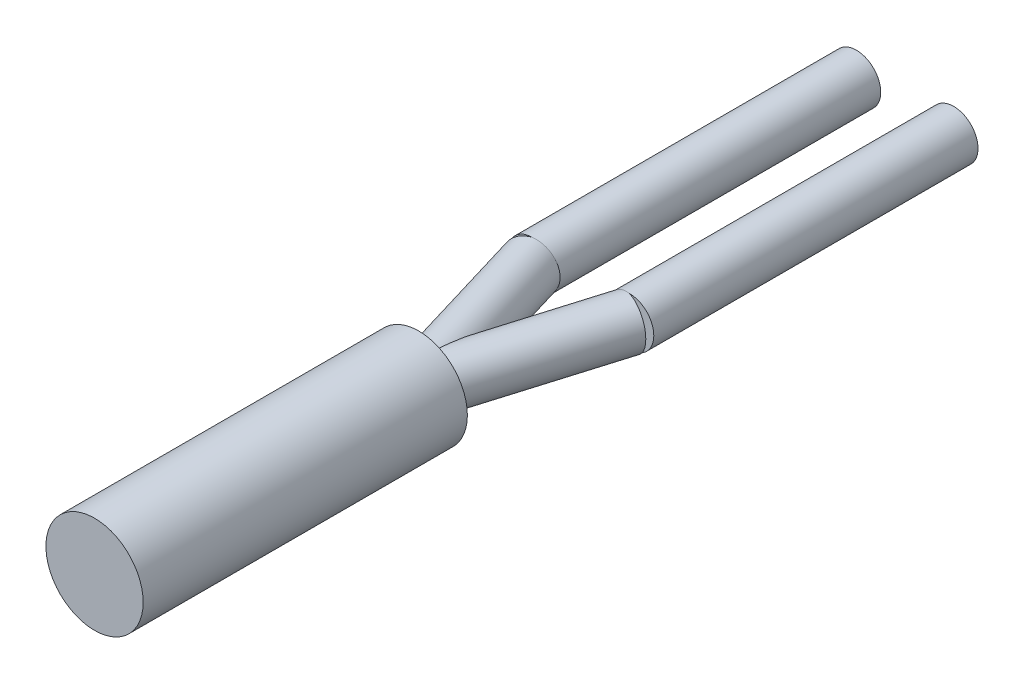
ISO-10303-21;
HEADER;
FILE_DESCRIPTION(('STEP AP214'),'2;1');
FILE_NAME('part.step','',(''),(''),'','','');
FILE_SCHEMA(('AUTOMOTIVE_DESIGN { 1 0 10303 214 1 1 1 1 }'));
ENDSEC;
DATA;
#1=APPLICATION_CONTEXT('core data for automotive mechanical design processes');
#2=APPLICATION_PROTOCOL_DEFINITION('international standard','automotive_design',2000,#1);
#3=PRODUCT_CONTEXT('',#1,'mechanical');
#4=PRODUCT('Part','Part','',(#3));
#5=PRODUCT_RELATED_PRODUCT_CATEGORY('part','',(#4));
#6=PRODUCT_DEFINITION_FORMATION('','',#4);
#7=PRODUCT_DEFINITION_CONTEXT('part definition',#1,'design');
#8=PRODUCT_DEFINITION('design','',#6,#7);
#9=PRODUCT_DEFINITION_SHAPE('','',#8);
#10=(LENGTH_UNIT() NAMED_UNIT(*) SI_UNIT(.MILLI.,.METRE.));
#11=(NAMED_UNIT(*) PLANE_ANGLE_UNIT() SI_UNIT($,.RADIAN.));
#12=(NAMED_UNIT(*) SI_UNIT($,.STERADIAN.) SOLID_ANGLE_UNIT());
#13=UNCERTAINTY_MEASURE_WITH_UNIT(LENGTH_MEASURE(1.E-05),#10,'distance_accuracy_value','');
#14=(GEOMETRIC_REPRESENTATION_CONTEXT(3) GLOBAL_UNCERTAINTY_ASSIGNED_CONTEXT((#13)) GLOBAL_UNIT_ASSIGNED_CONTEXT((#10,
#11,#12)) REPRESENTATION_CONTEXT('',''));
#15=CARTESIAN_POINT('',(0.,0.,0.));
#16=DIRECTION('',(0.,0.,1.));
#17=DIRECTION('',(1.,0.,0.));
#18=AXIS2_PLACEMENT_3D('',#15,#16,#17);
#19=CARTESIAN_POINT('',(0.,0.,500.));
#20=DIRECTION('',(0.,0.,1.));
#21=DIRECTION('',(1.,0.,0.));
#22=AXIS2_PLACEMENT_3D('',#19,#20,#21);
#23=PLANE('',#22);
#24=CARTESIAN_POINT('',(0.,0.,500.));
#25=DIRECTION('',(0.,0.,1.));
#26=DIRECTION('',(1.,0.,0.));
#27=AXIS2_PLACEMENT_3D('',#24,#25,#26);
#28=CIRCLE('',#27,30.);
#29=CARTESIAN_POINT('',(30.,0.,500.));
#30=VERTEX_POINT('',#29);
#31=EDGE_CURVE('E25',#30,#30,#28,.T.);
#32=ORIENTED_EDGE('',*,*,#31,.T.);
#33=EDGE_LOOP('',(#32));
#34=FACE_BOUND('',#33,.T.);
#35=ADVANCED_FACE('F16',(#34),#23,.T.);
#36=CARTESIAN_POINT('',(30.,0.,0.));
#37=DIRECTION('',(0.,0.,1.));
#38=DIRECTION('',(1.,0.,0.));
#39=AXIS2_PLACEMENT_3D('',#36,#37,#38);
#40=PLANE('',#39);
#41=CARTESIAN_POINT('',(30.,0.,0.));
#42=DIRECTION('',(0.,0.,1.));
#43=DIRECTION('',(1.,0.,0.));
#44=AXIS2_PLACEMENT_3D('',#41,#42,#43);
#45=CIRCLE('',#44,15.);
#46=CARTESIAN_POINT('',(45.,0.,0.));
#47=VERTEX_POINT('',#46);
#48=EDGE_CURVE('E93',#47,#47,#45,.T.);
#49=ORIENTED_EDGE('',*,*,#48,.F.);
#50=EDGE_LOOP('',(#49));
#51=FACE_BOUND('',#50,.T.);
#52=ADVANCED_FACE('F226',(#51),#40,.F.);
#53=CARTESIAN_POINT('',(30.,0.,200.));
#54=DIRECTION('',(0.,0.,1.));
#55=DIRECTION('',(1.,0.,0.));
#56=AXIS2_PLACEMENT_3D('',#53,#54,#55);
#57=PLANE('',#56);
#58=CARTESIAN_POINT('',(30.,0.,200.));
#59=DIRECTION('',(0.,0.,1.));
#60=DIRECTION('',(1.,0.,0.));
#61=AXIS2_PLACEMENT_3D('',#58,#59,#60);
#62=CIRCLE('',#61,15.);
#63=CARTESIAN_POINT('',(30.,-15.,200.));
#64=VERTEX_POINT('',#63);
#65=CARTESIAN_POINT('',(45.,0.,200.));
#66=VERTEX_POINT('',#65);
#67=EDGE_CURVE('E103',#64,#66,#62,.T.);
#68=ORIENTED_EDGE('',*,*,#67,.T.);
#69=CARTESIAN_POINT('',(30.,0.,200.));
#70=DIRECTION('',(0.,0.,1.));
#71=DIRECTION('',(1.,0.,0.));
#72=AXIS2_PLACEMENT_3D('',#69,#70,#71);
#73=CIRCLE('',#72,15.);
#74=CARTESIAN_POINT('',(30.,15.,200.));
#75=VERTEX_POINT('',#74);
#76=EDGE_CURVE('E98',#66,#75,#73,.T.);
#77=ORIENTED_EDGE('',*,*,#76,.T.);
#78=DIRECTION('',(0.,-1.,0.));
#79=VECTOR('',#78,1.);
#80=CARTESIAN_POINT('',(30.,0.,200.));
#81=LINE('',#80,#79);
#82=EDGE_CURVE('E111',#75,#64,#81,.T.);
#83=ORIENTED_EDGE('',*,*,#82,.T.);
#84=EDGE_LOOP('',(#68,#77,#83));
#85=FACE_BOUND('',#84,.T.);
#86=ADVANCED_FACE('F189',(#85),#57,.T.);
#87=CARTESIAN_POINT('',(0.,0.,300.));
#88=DIRECTION('',(0.,0.,1.));
#89=DIRECTION('',(1.,0.,0.));
#90=AXIS2_PLACEMENT_3D('',#87,#88,#89);
#91=CYLINDRICAL_SURFACE('',#90,30.);
#92=ORIENTED_EDGE('',*,*,#31,.F.);
#93=DIRECTION('',(0.,0.,1.));
#94=VECTOR('',#93,1.);
#95=CARTESIAN_POINT('',(30.,0.,300.));
#96=LINE('',#95,#94);
#97=CARTESIAN_POINT('',(30.,0.,300.));
#98=VERTEX_POINT('',#97);
#99=EDGE_CURVE('E10',#98,#30,#96,.T.);
#100=ORIENTED_EDGE('',*,*,#99,.F.);
#101=CARTESIAN_POINT('',(0.,0.,300.));
#102=DIRECTION('',(0.,0.,1.));
#103=DIRECTION('',(1.,0.,0.));
#104=AXIS2_PLACEMENT_3D('',#101,#102,#103);
#105=CIRCLE('',#104,30.);
#106=EDGE_CURVE('E115',#98,#98,#105,.T.);
#107=ORIENTED_EDGE('',*,*,#106,.T.);
#108=ORIENTED_EDGE('',*,*,#99,.T.);
#109=EDGE_LOOP('',(#92,#100,#107,#108));
#110=FACE_BOUND('',#109,.T.);
#111=ADVANCED_FACE('F232',(#110),#91,.T.);
#112=CARTESIAN_POINT('',(30.,0.,0.));
#113=DIRECTION('',(0.,0.,1.));
#114=DIRECTION('',(1.,0.,0.));
#115=AXIS2_PLACEMENT_3D('',#112,#113,#114);
#116=CYLINDRICAL_SURFACE('',#115,15.);
#117=DIRECTION('',(0.,0.,1.));
#118=VECTOR('',#117,1.);
#119=CARTESIAN_POINT('',(45.,0.,0.));
#120=LINE('',#119,#118);
#121=EDGE_CURVE('E95',#47,#66,#120,.T.);
#122=ORIENTED_EDGE('',*,*,#121,.T.);
#123=ORIENTED_EDGE('',*,*,#67,.F.);
#124=CARTESIAN_POINT('',(30.,0.,200.));
#125=DIRECTION('',(-0.145213144685078,0.,0.989400395497531));
#126=DIRECTION('',(0.989400395497531,0.,0.145213144685078));
#127=AXIS2_PLACEMENT_3D('',#124,#125,#126);
#128=ELLIPSE('',#127,15.160697396384,15.);
#129=EDGE_CURVE('E124',#75,#64,#128,.T.);
#130=ORIENTED_EDGE('',*,*,#129,.F.);
#131=ORIENTED_EDGE('',*,*,#76,.F.);
#132=ORIENTED_EDGE('',*,*,#121,.F.);
#133=ORIENTED_EDGE('',*,*,#48,.T.);
#134=EDGE_LOOP('',(#122,#123,#130,#131,#132,#133));
#135=FACE_BOUND('',#134,.T.);
#136=ADVANCED_FACE('F94',(#135),#116,.T.);
#137=CARTESIAN_POINT('',(30.,0.,200.));
#138=DIRECTION('',(-0.28734788556607,0.,0.957826285221234));
#139=DIRECTION('',(0.,1.,0.));
#140=AXIS2_PLACEMENT_3D('',#137,#138,#139);
#141=PLANE('',#140);
#142=ORIENTED_EDGE('',*,*,#82,.F.);
#143=CARTESIAN_POINT('',(30.,0.,200.));
#144=DIRECTION('',(-0.28734788556607,0.,0.957826285221234));
#145=DIRECTION('',(0.957826285221234,0.,0.28734788556607));
#146=AXIS2_PLACEMENT_3D('',#143,#144,#145);
#147=CIRCLE('',#146,15.);
#148=CARTESIAN_POINT('',(44.367394278317,0.,204.31021828349));
#149=VERTEX_POINT('',#148);
#150=EDGE_CURVE('E155',#149,#75,#147,.T.);
#151=ORIENTED_EDGE('',*,*,#150,.F.);
#152=CARTESIAN_POINT('',(30.,0.,200.));
#153=DIRECTION('',(-0.28734788556607,0.,0.957826285221234));
#154=DIRECTION('',(0.957826285221234,0.,0.28734788556607));
#155=AXIS2_PLACEMENT_3D('',#152,#153,#154);
#156=CIRCLE('',#155,15.);
#157=EDGE_CURVE('E121',#64,#149,#156,.T.);
#158=ORIENTED_EDGE('',*,*,#157,.F.);
#159=EDGE_LOOP('',(#142,#151,#158));
#160=FACE_BOUND('',#159,.T.);
#161=ADVANCED_FACE('F191',(#160),#141,.F.);
#162=CARTESIAN_POINT('',(0.,0.,300.));
#163=DIRECTION('',(0.,0.,1.));
#164=DIRECTION('',(1.,0.,0.));
#165=AXIS2_PLACEMENT_3D('',#162,#163,#164);
#166=PLANE('',#165);
#167=CARTESIAN_POINT('',(0.,0.,300.));
#168=DIRECTION('',(0.,0.,1.));
#169=DIRECTION('',(-1.,0.,0.));
#170=AXIS2_PLACEMENT_3D('',#167,#168,#169);
#171=ELLIPSE('',#170,15.660459763366,15.);
#172=CARTESIAN_POINT('',(0.,-15.,300.));
#173=VERTEX_POINT('',#172);
#174=CARTESIAN_POINT('',(15.660459763366,0.,300.));
#175=VERTEX_POINT('',#174);
#176=EDGE_CURVE('E118',#173,#175,#171,.T.);
#177=ORIENTED_EDGE('',*,*,#176,.T.);
#178=CARTESIAN_POINT('',(0.,0.,300.));
#179=DIRECTION('',(0.,0.,1.));
#180=DIRECTION('',(-1.,0.,0.));
#181=AXIS2_PLACEMENT_3D('',#178,#179,#180);
#182=ELLIPSE('',#181,15.660459763366,15.);
#183=CARTESIAN_POINT('',(0.,15.,300.));
#184=VERTEX_POINT('',#183);
#185=EDGE_CURVE('E125',#175,#184,#182,.T.);
#186=ORIENTED_EDGE('',*,*,#185,.T.);
#187=CARTESIAN_POINT('',(0.,0.,300.));
#188=DIRECTION('',(0.,0.,1.));
#189=DIRECTION('',(1.,0.,0.));
#190=AXIS2_PLACEMENT_3D('',#187,#188,#189);
#191=ELLIPSE('',#190,15.660459763366,15.);
#192=EDGE_CURVE('E133',#184,#173,#191,.T.);
#193=ORIENTED_EDGE('',*,*,#192,.T.);
#194=EDGE_LOOP('',(#177,#186,#193));
#195=FACE_BOUND('',#194,.T.);
#196=ORIENTED_EDGE('',*,*,#106,.F.);
#197=EDGE_LOOP('',(#196));
#198=FACE_BOUND('',#197,.T.);
#199=ADVANCED_FACE('F196',(#195,#198),#166,.F.);
#200=CARTESIAN_POINT('',(30.,0.,200.));
#201=DIRECTION('',(-0.28734788556607,0.,0.957826285221234));
#202=DIRECTION('',(0.957826285221234,0.,0.28734788556607));
#203=AXIS2_PLACEMENT_3D('',#200,#201,#202);
#204=CYLINDRICAL_SURFACE('',#203,15.);
#205=CARTESIAN_POINT('',(0.,0.,300.));
#206=DIRECTION('',(1.,0.,0.));
#207=DIRECTION('',(0.,0.,1.));
#208=AXIS2_PLACEMENT_3D('',#205,#206,#207);
#209=ELLIPSE('',#208,52.201532544553,15.);
#210=CARTESIAN_POINT('',(0.,0.,247.79846745544));
#211=VERTEX_POINT('',#210);
#212=EDGE_CURVE('E129',#211,#184,#209,.T.);
#213=ORIENTED_EDGE('',*,*,#212,.T.);
#214=ORIENTED_EDGE('',*,*,#185,.F.);
#215=DIRECTION('',(-0.28734788556607,0.,0.957826285221234));
#216=VECTOR('',#215,1.);
#217=CARTESIAN_POINT('',(44.367394278317,0.,204.31021828349));
#218=LINE('',#217,#216);
#219=EDGE_CURVE('E128',#149,#175,#218,.T.);
#220=ORIENTED_EDGE('',*,*,#219,.F.);
#221=ORIENTED_EDGE('',*,*,#150,.T.);
#222=ORIENTED_EDGE('',*,*,#129,.T.);
#223=ORIENTED_EDGE('',*,*,#157,.T.);
#224=ORIENTED_EDGE('',*,*,#219,.T.);
#225=ORIENTED_EDGE('',*,*,#176,.F.);
#226=CARTESIAN_POINT('',(0.,0.,300.));
#227=DIRECTION('',(1.,0.,0.));
#228=DIRECTION('',(0.,0.,1.));
#229=AXIS2_PLACEMENT_3D('',#226,#227,#228);
#230=ELLIPSE('',#229,52.201532544553,15.);
#231=EDGE_CURVE('E134',#173,#211,#230,.T.);
#232=ORIENTED_EDGE('',*,*,#231,.T.);
#233=EDGE_LOOP('',(#213,#214,#220,#221,#222,#223,#224,#225,#232));
#234=FACE_BOUND('',#233,.T.);
#235=ADVANCED_FACE('F183',(#234),#204,.T.);
#236=CARTESIAN_POINT('',(-30.,0.,200.));
#237=DIRECTION('',(0.28734788556607,0.,0.957826285221234));
#238=DIRECTION('',(0.,-1.,0.));
#239=AXIS2_PLACEMENT_3D('',#236,#237,#238);
#240=PLANE('',#239);
#241=CARTESIAN_POINT('',(-30.,0.,200.));
#242=DIRECTION('',(0.28734788556607,0.,0.957826285221234));
#243=DIRECTION('',(0.957826285221234,0.,-0.28734788556607));
#244=AXIS2_PLACEMENT_3D('',#241,#242,#243);
#245=CIRCLE('',#244,15.);
#246=CARTESIAN_POINT('',(-30.,15.,200.));
#247=VERTEX_POINT('',#246);
#248=CARTESIAN_POINT('',(-30.,-15.,200.));
#249=VERTEX_POINT('',#248);
#250=EDGE_CURVE('E142',#247,#249,#245,.T.);
#251=ORIENTED_EDGE('',*,*,#250,.F.);
#252=DIRECTION('',(0.,1.,0.));
#253=VECTOR('',#252,1.);
#254=CARTESIAN_POINT('',(-30.,0.,200.));
#255=LINE('',#254,#253);
#256=EDGE_CURVE('E146',#249,#247,#255,.T.);
#257=ORIENTED_EDGE('',*,*,#256,.F.);
#258=EDGE_LOOP('',(#251,#257));
#259=FACE_BOUND('',#258,.T.);
#260=ADVANCED_FACE('F211',(#259),#240,.F.);
#261=CARTESIAN_POINT('',(-30.,0.,0.));
#262=DIRECTION('',(0.,0.,1.));
#263=DIRECTION('',(1.,0.,0.));
#264=AXIS2_PLACEMENT_3D('',#261,#262,#263);
#265=PLANE('',#264);
#266=CARTESIAN_POINT('',(-30.,0.,0.));
#267=DIRECTION('',(0.,0.,1.));
#268=DIRECTION('',(1.,0.,0.));
#269=AXIS2_PLACEMENT_3D('',#266,#267,#268);
#270=CIRCLE('',#269,15.);
#271=CARTESIAN_POINT('',(-15.,0.,0.));
#272=VERTEX_POINT('',#271);
#273=EDGE_CURVE('E151',#272,#272,#270,.T.);
#274=ORIENTED_EDGE('',*,*,#273,.F.);
#275=EDGE_LOOP('',(#274));
#276=FACE_BOUND('',#275,.T.);
#277=ADVANCED_FACE('F213',(#276),#265,.F.);
#278=CARTESIAN_POINT('',(-30.,0.,200.));
#279=DIRECTION('',(0.28734788556607,0.,0.957826285221234));
#280=DIRECTION('',(0.957826285221234,0.,-0.28734788556607));
#281=AXIS2_PLACEMENT_3D('',#278,#279,#280);
#282=CYLINDRICAL_SURFACE('',#281,15.);
#283=ORIENTED_EDGE('',*,*,#250,.T.);
#284=CARTESIAN_POINT('',(-30.,0.,200.));
#285=DIRECTION('',(0.145213144685078,0.,0.989400395497531));
#286=DIRECTION('',(-0.989400395497531,0.,0.145213144685078));
#287=AXIS2_PLACEMENT_3D('',#284,#285,#286);
#288=ELLIPSE('',#287,15.160697396384,15.);
#289=CARTESIAN_POINT('',(-15.,0.,197.79846745544));
#290=VERTEX_POINT('',#289);
#291=EDGE_CURVE('E150',#249,#290,#288,.T.);
#292=ORIENTED_EDGE('',*,*,#291,.T.);
#293=DIRECTION('',(0.28734788556607,0.,0.957826285221234));
#294=VECTOR('',#293,1.);
#295=CARTESIAN_POINT('',(-15.63260572168,0.,195.6897817165));
#296=LINE('',#295,#294);
#297=EDGE_CURVE('E138',#290,#211,#296,.T.);
#298=ORIENTED_EDGE('',*,*,#297,.T.);
#299=ORIENTED_EDGE('',*,*,#231,.F.);
#300=ORIENTED_EDGE('',*,*,#192,.F.);
#301=ORIENTED_EDGE('',*,*,#212,.F.);
#302=ORIENTED_EDGE('',*,*,#297,.F.);
#303=CARTESIAN_POINT('',(-30.,0.,200.));
#304=DIRECTION('',(0.145213144685078,0.,0.989400395497531));
#305=DIRECTION('',(-0.989400395497531,0.,0.145213144685078));
#306=AXIS2_PLACEMENT_3D('',#303,#304,#305);
#307=ELLIPSE('',#306,15.160697396384,15.);
#308=EDGE_CURVE('E162',#290,#247,#307,.T.);
#309=ORIENTED_EDGE('',*,*,#308,.T.);
#310=EDGE_LOOP('',(#283,#292,#298,#299,#300,#301,#302,#309));
#311=FACE_BOUND('',#310,.T.);
#312=ADVANCED_FACE('F199',(#311),#282,.T.);
#313=CARTESIAN_POINT('',(-30.,0.,200.));
#314=DIRECTION('',(0.,0.,1.));
#315=DIRECTION('',(1.,0.,0.));
#316=AXIS2_PLACEMENT_3D('',#313,#314,#315);
#317=PLANE('',#316);
#318=ORIENTED_EDGE('',*,*,#256,.T.);
#319=CARTESIAN_POINT('',(-30.,0.,200.));
#320=DIRECTION('',(0.,0.,1.));
#321=DIRECTION('',(1.,0.,0.));
#322=AXIS2_PLACEMENT_3D('',#319,#320,#321);
#323=CIRCLE('',#322,15.);
#324=EDGE_CURVE('E169',#247,#249,#323,.T.);
#325=ORIENTED_EDGE('',*,*,#324,.T.);
#326=EDGE_LOOP('',(#318,#325));
#327=FACE_BOUND('',#326,.T.);
#328=ADVANCED_FACE('F209',(#327),#317,.T.);
#329=CARTESIAN_POINT('',(-30.,0.,0.));
#330=DIRECTION('',(0.,0.,1.));
#331=DIRECTION('',(1.,0.,0.));
#332=AXIS2_PLACEMENT_3D('',#329,#330,#331);
#333=CYLINDRICAL_SURFACE('',#332,15.);
#334=ORIENTED_EDGE('',*,*,#324,.F.);
#335=ORIENTED_EDGE('',*,*,#308,.F.);
#336=DIRECTION('',(0.,0.,1.));
#337=VECTOR('',#336,1.);
#338=CARTESIAN_POINT('',(-15.,0.,0.));
#339=LINE('',#338,#337);
#340=EDGE_CURVE('E154',#272,#290,#339,.T.);
#341=ORIENTED_EDGE('',*,*,#340,.F.);
#342=ORIENTED_EDGE('',*,*,#273,.T.);
#343=ORIENTED_EDGE('',*,*,#340,.T.);
#344=ORIENTED_EDGE('',*,*,#291,.F.);
#345=EDGE_LOOP('',(#334,#335,#341,#342,#343,#344));
#346=FACE_BOUND('',#345,.T.);
#347=ADVANCED_FACE('F207',(#346),#333,.T.);
#348=CLOSED_SHELL('',(#35,#52,#86,#111,#136,#161,#199,#235,#260,#277,#312,#328,#347));
#349=MANIFOLD_SOLID_BREP('B1',#348);
#350=ADVANCED_BREP_SHAPE_REPRESENTATION('',(#18,#349),#14);
#351=SHAPE_DEFINITION_REPRESENTATION(#9,#350);
ENDSEC;
END-ISO-10303-21;
